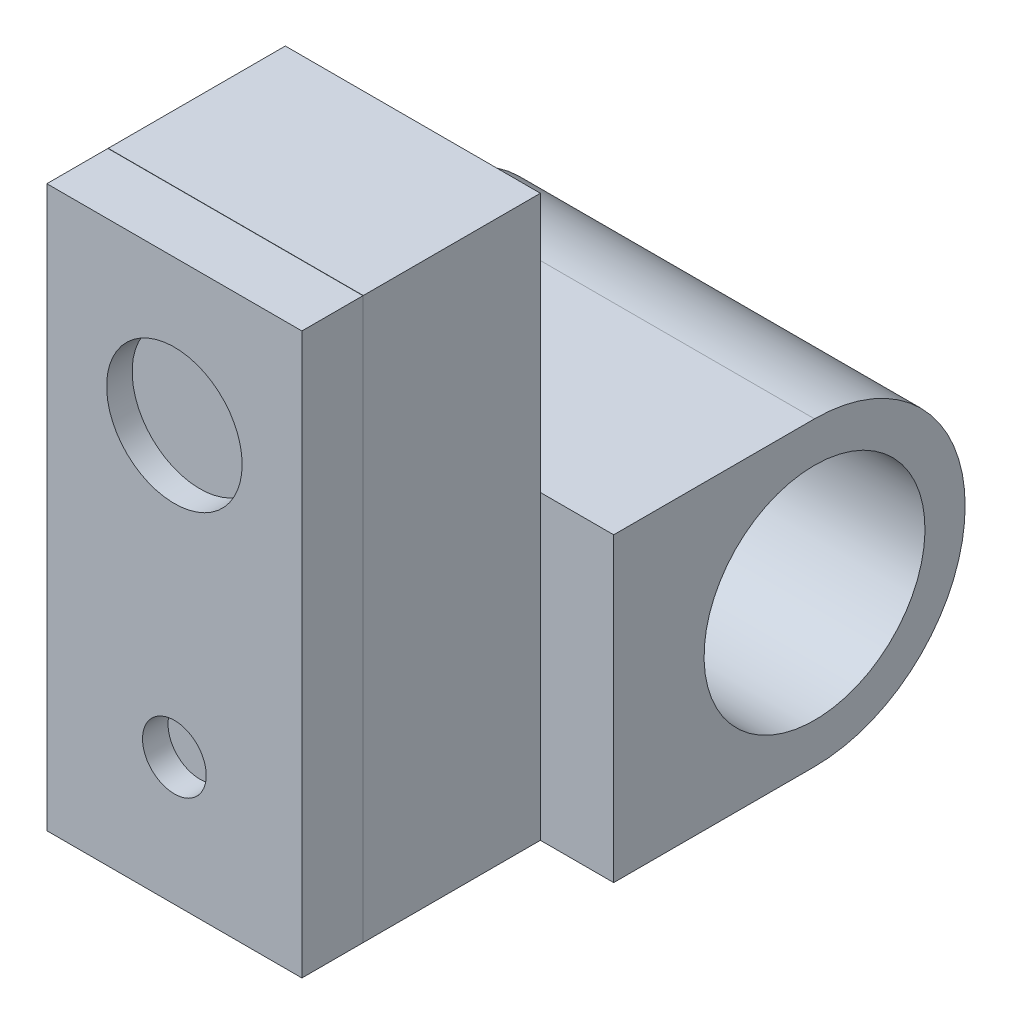
ISO-10303-21;
HEADER;
FILE_DESCRIPTION(('STEP AP214'),'2;1');
FILE_NAME('part.step','',(''),(''),'','','');
FILE_SCHEMA(('AUTOMOTIVE_DESIGN { 1 0 10303 214 1 1 1 1 }'));
ENDSEC;
DATA;
#1=APPLICATION_CONTEXT('core data for automotive mechanical design processes');
#2=APPLICATION_PROTOCOL_DEFINITION('international standard','automotive_design',2000,#1);
#3=PRODUCT_CONTEXT('',#1,'mechanical');
#4=PRODUCT('Part','Part','',(#3));
#5=PRODUCT_RELATED_PRODUCT_CATEGORY('part','',(#4));
#6=PRODUCT_DEFINITION_FORMATION('','',#4);
#7=PRODUCT_DEFINITION_CONTEXT('part definition',#1,'design');
#8=PRODUCT_DEFINITION('design','',#6,#7);
#9=PRODUCT_DEFINITION_SHAPE('','',#8);
#10=(LENGTH_UNIT() NAMED_UNIT(*) SI_UNIT(.MILLI.,.METRE.));
#11=(NAMED_UNIT(*) PLANE_ANGLE_UNIT() SI_UNIT($,.RADIAN.));
#12=(NAMED_UNIT(*) SI_UNIT($,.STERADIAN.) SOLID_ANGLE_UNIT());
#13=UNCERTAINTY_MEASURE_WITH_UNIT(LENGTH_MEASURE(1.E-05),#10,'distance_accuracy_value','');
#14=(GEOMETRIC_REPRESENTATION_CONTEXT(3) GLOBAL_UNCERTAINTY_ASSIGNED_CONTEXT((#13)) GLOBAL_UNIT_ASSIGNED_CONTEXT((#10,
#11,#12)) REPRESENTATION_CONTEXT('',''));
#15=CARTESIAN_POINT('',(0.,0.,0.));
#16=DIRECTION('',(0.,0.,1.));
#17=DIRECTION('',(1.,0.,0.));
#18=AXIS2_PLACEMENT_3D('',#15,#16,#17);
#19=CARTESIAN_POINT('',(-12.7,-27.9019,11.8745));
#20=DIRECTION('',(0.,1.,0.));
#21=DIRECTION('',(0.,0.,1.));
#22=AXIS2_PLACEMENT_3D('',#19,#20,#21);
#23=PLANE('',#22);
#24=DIRECTION('',(1.,0.,0.));
#25=VECTOR('',#24,1.);
#26=CARTESIAN_POINT('',(-32.,-27.9019,-31.8745));
#27=LINE('',#26,#25);
#28=CARTESIAN_POINT('',(-20.,-27.9019,-31.8745));
#29=VERTEX_POINT('',#28);
#30=CARTESIAN_POINT('',(20.,-27.9019,-31.8745));
#31=VERTEX_POINT('',#30);
#32=EDGE_CURVE('E166',#29,#31,#27,.T.);
#33=ORIENTED_EDGE('',*,*,#32,.T.);
#34=DIRECTION('',(0.,0.,1.));
#35=VECTOR('',#34,1.);
#36=CARTESIAN_POINT('',(20.,-27.9019,-51.8745));
#37=LINE('',#36,#35);
#38=CARTESIAN_POINT('',(20.,-27.9019,-11.8745));
#39=VERTEX_POINT('',#38);
#40=EDGE_CURVE('E176',#31,#39,#37,.T.);
#41=ORIENTED_EDGE('',*,*,#40,.T.);
#42=DIRECTION('',(-1.,0.,0.));
#43=VECTOR('',#42,1.);
#44=CARTESIAN_POINT('',(20.,-27.9019,-11.8745));
#45=LINE('',#44,#43);
#46=CARTESIAN_POINT('',(12.7,-27.9019,-11.8745));
#47=VERTEX_POINT('',#46);
#48=EDGE_CURVE('E356',#39,#47,#45,.T.);
#49=ORIENTED_EDGE('',*,*,#48,.T.);
#50=DIRECTION('',(0.,0.,-1.));
#51=VECTOR('',#50,1.);
#52=CARTESIAN_POINT('',(12.7,-27.9019,11.8745));
#53=LINE('',#52,#51);
#54=CARTESIAN_POINT('',(12.7,-27.9019,5.7658));
#55=VERTEX_POINT('',#54);
#56=EDGE_CURVE('E309',#55,#47,#53,.T.);
#57=ORIENTED_EDGE('',*,*,#56,.F.);
#58=DIRECTION('',(1.,0.,0.));
#59=VECTOR('',#58,1.);
#60=CARTESIAN_POINT('',(-12.7,-27.9019,5.7658));
#61=LINE('',#60,#59);
#62=CARTESIAN_POINT('',(-12.7,-27.9019,5.7658));
#63=VERTEX_POINT('',#62);
#64=EDGE_CURVE('E252',#63,#55,#61,.T.);
#65=ORIENTED_EDGE('',*,*,#64,.F.);
#66=DIRECTION('',(0.,0.,-1.));
#67=VECTOR('',#66,1.);
#68=CARTESIAN_POINT('',(-12.7,-27.9019,11.8745));
#69=LINE('',#68,#67);
#70=CARTESIAN_POINT('',(-12.7,-27.9019,-11.8745));
#71=VERTEX_POINT('',#70);
#72=EDGE_CURVE('E314',#63,#71,#69,.T.);
#73=ORIENTED_EDGE('',*,*,#72,.T.);
#74=CARTESIAN_POINT('',(-20.,-27.9019,-11.8745));
#75=VERTEX_POINT('',#74);
#76=EDGE_CURVE('E348',#71,#75,#45,.T.);
#77=ORIENTED_EDGE('',*,*,#76,.T.);
#78=DIRECTION('',(0.,0.,1.));
#79=VECTOR('',#78,1.);
#80=CARTESIAN_POINT('',(-20.,-27.9019,-51.8745));
#81=LINE('',#80,#79);
#82=EDGE_CURVE('E179',#29,#75,#81,.T.);
#83=ORIENTED_EDGE('',*,*,#82,.F.);
#84=EDGE_LOOP('',(#33,#41,#49,#57,#65,#73,#77,#83));
#85=FACE_BOUND('',#84,.T.);
#86=ADVANCED_FACE('F41',(#85),#23,.F.);
#87=CARTESIAN_POINT('',(-12.7,-27.9019,-11.8745));
#88=DIRECTION('',(0.,0.,1.));
#89=DIRECTION('',(1.,0.,0.));
#90=AXIS2_PLACEMENT_3D('',#87,#88,#89);
#91=PLANE('',#90);
#92=DIRECTION('',(1.,0.,0.));
#93=VECTOR('',#92,1.);
#94=CARTESIAN_POINT('',(20.,2.0981,-11.8745));
#95=LINE('',#94,#93);
#96=CARTESIAN_POINT('',(-12.7,2.09810000000001,-11.8745));
#97=VERTEX_POINT('',#96);
#98=CARTESIAN_POINT('',(12.7,2.0981,-11.8745));
#99=VERTEX_POINT('',#98);
#100=EDGE_CURVE('E12',#97,#99,#95,.T.);
#101=ORIENTED_EDGE('',*,*,#100,.F.);
#102=DIRECTION('',(0.,-1.,0.));
#103=VECTOR('',#102,1.);
#104=CARTESIAN_POINT('',(-12.7,27.9019,-11.8745));
#105=LINE('',#104,#103);
#106=CARTESIAN_POINT('',(-12.7,27.9019,-11.8745));
#107=VERTEX_POINT('',#106);
#108=EDGE_CURVE('E275',#107,#97,#105,.T.);
#109=ORIENTED_EDGE('',*,*,#108,.F.);
#110=DIRECTION('',(-1.,0.,0.));
#111=VECTOR('',#110,1.);
#112=CARTESIAN_POINT('',(-12.7,27.9019,-11.8745));
#113=LINE('',#112,#111);
#114=CARTESIAN_POINT('',(12.7,27.9019,-11.8745));
#115=VERTEX_POINT('',#114);
#116=EDGE_CURVE('E282',#115,#107,#113,.T.);
#117=ORIENTED_EDGE('',*,*,#116,.F.);
#118=DIRECTION('',(0.,1.,0.));
#119=VECTOR('',#118,1.);
#120=CARTESIAN_POINT('',(12.7,27.9019,-11.8745));
#121=LINE('',#120,#119);
#122=EDGE_CURVE('E278',#99,#115,#121,.T.);
#123=ORIENTED_EDGE('',*,*,#122,.F.);
#124=EDGE_LOOP('',(#101,#109,#117,#123));
#125=FACE_BOUND('',#124,.T.);
#126=ADVANCED_FACE('F400',(#125),#91,.F.);
#127=CARTESIAN_POINT('',(-12.7,27.9019,11.8745));
#128=DIRECTION('',(1.,0.,0.));
#129=DIRECTION('',(0.,1.,0.));
#130=AXIS2_PLACEMENT_3D('',#127,#128,#129);
#131=PLANE('',#130);
#132=DIRECTION('',(0.,0.,-1.));
#133=VECTOR('',#132,1.);
#134=CARTESIAN_POINT('',(-12.7,27.9019,11.8745));
#135=LINE('',#134,#133);
#136=CARTESIAN_POINT('',(-12.7,27.9019,11.8745));
#137=VERTEX_POINT('',#136);
#138=CARTESIAN_POINT('',(-12.7,27.9019,5.7912));
#139=VERTEX_POINT('',#138);
#140=EDGE_CURVE('E300',#137,#139,#135,.T.);
#141=ORIENTED_EDGE('',*,*,#140,.T.);
#142=DIRECTION('',(0.,-1.,0.));
#143=VECTOR('',#142,1.);
#144=CARTESIAN_POINT('',(-12.7,27.9019,5.7912));
#145=LINE('',#144,#143);
#146=CARTESIAN_POINT('',(-12.7,-27.9019,5.7912));
#147=VERTEX_POINT('',#146);
#148=EDGE_CURVE('E245',#139,#147,#145,.T.);
#149=ORIENTED_EDGE('',*,*,#148,.T.);
#150=CARTESIAN_POINT('',(-12.7,-27.9019,11.8745));
#151=VERTEX_POINT('',#150);
#152=EDGE_CURVE('E315',#151,#147,#69,.T.);
#153=ORIENTED_EDGE('',*,*,#152,.F.);
#154=DIRECTION('',(0.,-1.,0.));
#155=VECTOR('',#154,1.);
#156=CARTESIAN_POINT('',(-12.7,27.9019,11.8745));
#157=LINE('',#156,#155);
#158=EDGE_CURVE('E286',#137,#151,#157,.T.);
#159=ORIENTED_EDGE('',*,*,#158,.F.);
#160=EDGE_LOOP('',(#141,#149,#153,#159));
#161=FACE_BOUND('',#160,.T.);
#162=ADVANCED_FACE('F43',(#161),#131,.F.);
#163=ORIENTED_EDGE('',*,*,#152,.T.);
#164=DIRECTION('',(1.,0.,0.));
#165=VECTOR('',#164,1.);
#166=CARTESIAN_POINT('',(-12.7,-27.9019,5.7912));
#167=LINE('',#166,#165);
#168=CARTESIAN_POINT('',(12.7,-27.9019,5.7912));
#169=VERTEX_POINT('',#168);
#170=EDGE_CURVE('E241',#147,#169,#167,.T.);
#171=ORIENTED_EDGE('',*,*,#170,.T.);
#172=CARTESIAN_POINT('',(12.7,-27.9019,11.8745));
#173=VERTEX_POINT('',#172);
#174=EDGE_CURVE('E310',#173,#169,#53,.T.);
#175=ORIENTED_EDGE('',*,*,#174,.F.);
#176=DIRECTION('',(1.,0.,0.));
#177=VECTOR('',#176,1.);
#178=CARTESIAN_POINT('',(-12.7,-27.9019,11.8745));
#179=LINE('',#178,#177);
#180=EDGE_CURVE('E290',#151,#173,#179,.T.);
#181=ORIENTED_EDGE('',*,*,#180,.F.);
#182=EDGE_LOOP('',(#163,#171,#175,#181));
#183=FACE_BOUND('',#182,.T.);
#184=ADVANCED_FACE('F401',(#183),#23,.F.);
#185=CARTESIAN_POINT('',(12.7,27.9019,11.8745));
#186=DIRECTION('',(-1.,0.,0.));
#187=DIRECTION('',(0.,-1.,0.));
#188=AXIS2_PLACEMENT_3D('',#185,#186,#187);
#189=PLANE('',#188);
#190=ORIENTED_EDGE('',*,*,#174,.T.);
#191=DIRECTION('',(0.,1.,0.));
#192=VECTOR('',#191,1.);
#193=CARTESIAN_POINT('',(12.7,27.9019,5.7912));
#194=LINE('',#193,#192);
#195=CARTESIAN_POINT('',(12.7,27.9019,5.7912));
#196=VERTEX_POINT('',#195);
#197=EDGE_CURVE('E228',#169,#196,#194,.T.);
#198=ORIENTED_EDGE('',*,*,#197,.T.);
#199=DIRECTION('',(0.,0.,-1.));
#200=VECTOR('',#199,1.);
#201=CARTESIAN_POINT('',(12.7,27.9019,11.8745));
#202=LINE('',#201,#200);
#203=CARTESIAN_POINT('',(12.7,27.9019,11.8745));
#204=VERTEX_POINT('',#203);
#205=EDGE_CURVE('E305',#204,#196,#202,.T.);
#206=ORIENTED_EDGE('',*,*,#205,.F.);
#207=DIRECTION('',(0.,1.,0.));
#208=VECTOR('',#207,1.);
#209=CARTESIAN_POINT('',(12.7,27.9019,11.8745));
#210=LINE('',#209,#208);
#211=EDGE_CURVE('E293',#173,#204,#210,.T.);
#212=ORIENTED_EDGE('',*,*,#211,.F.);
#213=EDGE_LOOP('',(#190,#198,#206,#212));
#214=FACE_BOUND('',#213,.T.);
#215=ADVANCED_FACE('F408',(#214),#189,.F.);
#216=CARTESIAN_POINT('',(-12.7,27.9019,11.8745));
#217=DIRECTION('',(0.,-1.,0.));
#218=DIRECTION('',(0.,0.,-1.));
#219=AXIS2_PLACEMENT_3D('',#216,#217,#218);
#220=PLANE('',#219);
#221=ORIENTED_EDGE('',*,*,#205,.T.);
#222=DIRECTION('',(-1.,0.,0.));
#223=VECTOR('',#222,1.);
#224=CARTESIAN_POINT('',(-12.7,27.9019,5.7912));
#225=LINE('',#224,#223);
#226=EDGE_CURVE('E319',#196,#139,#225,.T.);
#227=ORIENTED_EDGE('',*,*,#226,.T.);
#228=ORIENTED_EDGE('',*,*,#140,.F.);
#229=DIRECTION('',(-1.,0.,0.));
#230=VECTOR('',#229,1.);
#231=CARTESIAN_POINT('',(-12.7,27.9019,11.8745));
#232=LINE('',#231,#230);
#233=EDGE_CURVE('E296',#204,#137,#232,.T.);
#234=ORIENTED_EDGE('',*,*,#233,.F.);
#235=EDGE_LOOP('',(#221,#227,#228,#234));
#236=FACE_BOUND('',#235,.T.);
#237=ADVANCED_FACE('F414',(#236),#220,.F.);
#238=CARTESIAN_POINT('',(-12.7,-27.9019,11.8745));
#239=DIRECTION('',(0.,0.,1.));
#240=DIRECTION('',(1.,0.,0.));
#241=AXIS2_PLACEMENT_3D('',#238,#239,#240);
#242=PLANE('',#241);
#243=CARTESIAN_POINT('',(0.,-15.2019,11.8745));
#244=DIRECTION('',(0.,0.,1.));
#245=DIRECTION('',(1.,0.,0.));
#246=AXIS2_PLACEMENT_3D('',#243,#244,#245);
#247=CIRCLE('',#246,3.175);
#248=CARTESIAN_POINT('',(3.175,-15.2019,11.8745));
#249=VERTEX_POINT('',#248);
#250=EDGE_CURVE('E258',#249,#249,#247,.T.);
#251=ORIENTED_EDGE('',*,*,#250,.F.);
#252=EDGE_LOOP('',(#251));
#253=FACE_BOUND('',#252,.T.);
#254=CARTESIAN_POINT('',(0.,13.4112,11.8745));
#255=DIRECTION('',(0.,0.,1.));
#256=DIRECTION('',(1.,0.,0.));
#257=AXIS2_PLACEMENT_3D('',#254,#255,#256);
#258=CIRCLE('',#257,6.746875);
#259=CARTESIAN_POINT('',(6.746875,13.4112,11.8745));
#260=VERTEX_POINT('',#259);
#261=EDGE_CURVE('E266',#260,#260,#258,.T.);
#262=ORIENTED_EDGE('',*,*,#261,.F.);
#263=EDGE_LOOP('',(#262));
#264=FACE_BOUND('',#263,.T.);
#265=ORIENTED_EDGE('',*,*,#158,.T.);
#266=ORIENTED_EDGE('',*,*,#180,.T.);
#267=ORIENTED_EDGE('',*,*,#211,.T.);
#268=ORIENTED_EDGE('',*,*,#233,.T.);
#269=EDGE_LOOP('',(#265,#266,#267,#268));
#270=FACE_BOUND('',#269,.T.);
#271=ADVANCED_FACE('F429',(#253,#264,#270),#242,.T.);
#272=CARTESIAN_POINT('',(0.,13.4112,9.3345));
#273=DIRECTION('',(0.,0.,1.));
#274=DIRECTION('',(1.,0.,0.));
#275=AXIS2_PLACEMENT_3D('',#272,#273,#274);
#276=CYLINDRICAL_SURFACE('',#275,6.746875);
#277=CARTESIAN_POINT('',(0.,13.4112,9.3345));
#278=DIRECTION('',(0.,0.,1.));
#279=DIRECTION('',(1.,0.,0.));
#280=AXIS2_PLACEMENT_3D('',#277,#278,#279);
#281=CIRCLE('',#280,6.746875);
#282=CARTESIAN_POINT('',(6.746875,13.4112,9.3345));
#283=VERTEX_POINT('',#282);
#284=EDGE_CURVE('E270',#283,#283,#281,.T.);
#285=ORIENTED_EDGE('',*,*,#284,.F.);
#286=EDGE_LOOP('',(#285));
#287=FACE_BOUND('',#286,.T.);
#288=ORIENTED_EDGE('',*,*,#261,.T.);
#289=EDGE_LOOP('',(#288));
#290=FACE_BOUND('',#289,.T.);
#291=ADVANCED_FACE('F431',(#287,#290),#276,.F.);
#292=CARTESIAN_POINT('',(0.,13.4112,9.3345));
#293=DIRECTION('',(0.,0.,1.));
#294=DIRECTION('',(1.,0.,0.));
#295=AXIS2_PLACEMENT_3D('',#292,#293,#294);
#296=PLANE('',#295);
#297=ORIENTED_EDGE('',*,*,#284,.T.);
#298=EDGE_LOOP('',(#297));
#299=FACE_BOUND('',#298,.T.);
#300=ADVANCED_FACE('F438',(#299),#296,.T.);
#301=CARTESIAN_POINT('',(0.,-15.2019,0.354243878930845));
#302=DIRECTION('',(0.,0.,1.));
#303=DIRECTION('',(1.,0.,0.));
#304=AXIS2_PLACEMENT_3D('',#301,#302,#303);
#305=CYLINDRICAL_SURFACE('',#304,3.175);
#306=CARTESIAN_POINT('',(0.,-15.2019,9.3345));
#307=DIRECTION('',(0.,0.,1.));
#308=DIRECTION('',(1.,0.,0.));
#309=AXIS2_PLACEMENT_3D('',#306,#307,#308);
#310=CIRCLE('',#309,3.175);
#311=CARTESIAN_POINT('',(3.175,-15.2019,9.3345));
#312=VERTEX_POINT('',#311);
#313=EDGE_CURVE('E262',#312,#312,#310,.F.);
#314=ORIENTED_EDGE('',*,*,#313,.T.);
#315=EDGE_LOOP('',(#314));
#316=FACE_BOUND('',#315,.T.);
#317=ORIENTED_EDGE('',*,*,#250,.T.);
#318=EDGE_LOOP('',(#317));
#319=FACE_BOUND('',#318,.T.);
#320=ADVANCED_FACE('F447',(#316,#319),#305,.F.);
#321=CARTESIAN_POINT('',(0.,13.4112,9.3345));
#322=DIRECTION('',(0.,0.,1.));
#323=DIRECTION('',(1.,0.,0.));
#324=AXIS2_PLACEMENT_3D('',#321,#322,#323);
#325=PLANE('',#324);
#326=ORIENTED_EDGE('',*,*,#313,.F.);
#327=EDGE_LOOP('',(#326));
#328=FACE_BOUND('',#327,.T.);
#329=ADVANCED_FACE('F451',(#328),#325,.T.);
#330=CARTESIAN_POINT('',(0.,0.,5.7658));
#331=DIRECTION('',(0.,0.,1.));
#332=DIRECTION('',(1.,0.,0.));
#333=AXIS2_PLACEMENT_3D('',#330,#331,#332);
#334=PLANE('',#333);
#335=DIRECTION('',(0.,-1.,0.));
#336=VECTOR('',#335,1.);
#337=CARTESIAN_POINT('',(-12.573,27.7749,5.7658));
#338=LINE('',#337,#336);
#339=CARTESIAN_POINT('',(-12.573,27.7749,5.7658));
#340=VERTEX_POINT('',#339);
#341=CARTESIAN_POINT('',(-12.573,-27.7749,5.7658));
#342=VERTEX_POINT('',#341);
#343=EDGE_CURVE('E220',#340,#342,#338,.T.);
#344=ORIENTED_EDGE('',*,*,#343,.F.);
#345=DIRECTION('',(-1.,0.,0.));
#346=VECTOR('',#345,1.);
#347=CARTESIAN_POINT('',(12.573,27.7749,5.7658));
#348=LINE('',#347,#346);
#349=CARTESIAN_POINT('',(12.573,27.7749,5.7658));
#350=VERTEX_POINT('',#349);
#351=EDGE_CURVE('E216',#350,#340,#348,.T.);
#352=ORIENTED_EDGE('',*,*,#351,.F.);
#353=DIRECTION('',(0.,1.,0.));
#354=VECTOR('',#353,1.);
#355=CARTESIAN_POINT('',(12.573,-27.7749,5.7658));
#356=LINE('',#355,#354);
#357=CARTESIAN_POINT('',(12.573,-27.7749,5.7658));
#358=VERTEX_POINT('',#357);
#359=EDGE_CURVE('E212',#358,#350,#356,.T.);
#360=ORIENTED_EDGE('',*,*,#359,.F.);
#361=DIRECTION('',(1.,0.,0.));
#362=VECTOR('',#361,1.);
#363=CARTESIAN_POINT('',(-12.573,-27.7749,5.7658));
#364=LINE('',#363,#362);
#365=EDGE_CURVE('E208',#342,#358,#364,.T.);
#366=ORIENTED_EDGE('',*,*,#365,.F.);
#367=EDGE_LOOP('',(#344,#352,#360,#366));
#368=FACE_BOUND('',#367,.T.);
#369=DIRECTION('',(0.,-1.,0.));
#370=VECTOR('',#369,1.);
#371=CARTESIAN_POINT('',(-12.7,27.9019,5.7658));
#372=LINE('',#371,#370);
#373=CARTESIAN_POINT('',(-12.7,27.9019,5.7658));
#374=VERTEX_POINT('',#373);
#375=EDGE_CURVE('E255',#374,#63,#372,.T.);
#376=ORIENTED_EDGE('',*,*,#375,.T.);
#377=ORIENTED_EDGE('',*,*,#64,.T.);
#378=DIRECTION('',(0.,1.,0.));
#379=VECTOR('',#378,1.);
#380=CARTESIAN_POINT('',(12.7,27.9019,5.7658));
#381=LINE('',#380,#379);
#382=CARTESIAN_POINT('',(12.7,27.9019,5.7658));
#383=VERTEX_POINT('',#382);
#384=EDGE_CURVE('E249',#55,#383,#381,.T.);
#385=ORIENTED_EDGE('',*,*,#384,.T.);
#386=DIRECTION('',(-1.,0.,0.));
#387=VECTOR('',#386,1.);
#388=CARTESIAN_POINT('',(-12.7,27.9019,5.7658));
#389=LINE('',#388,#387);
#390=EDGE_CURVE('E51',#383,#374,#389,.T.);
#391=ORIENTED_EDGE('',*,*,#390,.T.);
#392=EDGE_LOOP('',(#376,#377,#385,#391));
#393=FACE_BOUND('',#392,.T.);
#394=ADVANCED_FACE('F326',(#368,#393),#334,.T.);
#395=CARTESIAN_POINT('',(0.,0.,5.7912));
#396=DIRECTION('',(0.,0.,1.));
#397=DIRECTION('',(1.,0.,0.));
#398=AXIS2_PLACEMENT_3D('',#395,#396,#397);
#399=PLANE('',#398);
#400=DIRECTION('',(1.,0.,0.));
#401=VECTOR('',#400,1.);
#402=CARTESIAN_POINT('',(-12.573,-27.7749,5.7912));
#403=LINE('',#402,#401);
#404=CARTESIAN_POINT('',(-12.573,-27.7749,5.7912));
#405=VERTEX_POINT('',#404);
#406=CARTESIAN_POINT('',(12.573,-27.7749,5.7912));
#407=VERTEX_POINT('',#406);
#408=EDGE_CURVE('E187',#405,#407,#403,.T.);
#409=ORIENTED_EDGE('',*,*,#408,.T.);
#410=DIRECTION('',(0.,1.,0.));
#411=VECTOR('',#410,1.);
#412=CARTESIAN_POINT('',(12.573,-27.7749,5.7912));
#413=LINE('',#412,#411);
#414=CARTESIAN_POINT('',(12.573,27.7749,5.7912));
#415=VERTEX_POINT('',#414);
#416=EDGE_CURVE('E191',#407,#415,#413,.T.);
#417=ORIENTED_EDGE('',*,*,#416,.T.);
#418=DIRECTION('',(-1.,0.,0.));
#419=VECTOR('',#418,1.);
#420=CARTESIAN_POINT('',(12.573,27.7749,5.7912));
#421=LINE('',#420,#419);
#422=CARTESIAN_POINT('',(-12.573,27.7749,5.7912));
#423=VERTEX_POINT('',#422);
#424=EDGE_CURVE('E200',#415,#423,#421,.T.);
#425=ORIENTED_EDGE('',*,*,#424,.T.);
#426=DIRECTION('',(0.,-1.,0.));
#427=VECTOR('',#426,1.);
#428=CARTESIAN_POINT('',(-12.573,27.7749,5.7912));
#429=LINE('',#428,#427);
#430=EDGE_CURVE('E204',#423,#405,#429,.T.);
#431=ORIENTED_EDGE('',*,*,#430,.T.);
#432=EDGE_LOOP('',(#409,#417,#425,#431));
#433=FACE_BOUND('',#432,.T.);
#434=ORIENTED_EDGE('',*,*,#226,.F.);
#435=ORIENTED_EDGE('',*,*,#197,.F.);
#436=ORIENTED_EDGE('',*,*,#170,.F.);
#437=ORIENTED_EDGE('',*,*,#148,.F.);
#438=EDGE_LOOP('',(#434,#435,#436,#437));
#439=FACE_BOUND('',#438,.T.);
#440=ADVANCED_FACE('F423',(#433,#439),#399,.F.);
#441=CARTESIAN_POINT('',(-12.573,-27.7749,5.7658));
#442=DIRECTION('',(0.,-1.,0.));
#443=DIRECTION('',(0.,0.,-1.));
#444=AXIS2_PLACEMENT_3D('',#441,#442,#443);
#445=PLANE('',#444);
#446=ORIENTED_EDGE('',*,*,#408,.F.);
#447=DIRECTION('',(0.,0.,1.));
#448=VECTOR('',#447,1.);
#449=CARTESIAN_POINT('',(-12.573,-27.7749,5.7658));
#450=LINE('',#449,#448);
#451=EDGE_CURVE('E225',#342,#405,#450,.T.);
#452=ORIENTED_EDGE('',*,*,#451,.F.);
#453=ORIENTED_EDGE('',*,*,#365,.T.);
#454=DIRECTION('',(0.,0.,1.));
#455=VECTOR('',#454,1.);
#456=CARTESIAN_POINT('',(12.573,-27.7749,5.7658));
#457=LINE('',#456,#455);
#458=EDGE_CURVE('E224',#358,#407,#457,.T.);
#459=ORIENTED_EDGE('',*,*,#458,.T.);
#460=EDGE_LOOP('',(#446,#452,#453,#459));
#461=FACE_BOUND('',#460,.T.);
#462=ADVANCED_FACE('F461',(#461),#445,.T.);
#463=CARTESIAN_POINT('',(-12.573,27.7749,5.7658));
#464=DIRECTION('',(-1.,0.,0.));
#465=DIRECTION('',(0.,-1.,0.));
#466=AXIS2_PLACEMENT_3D('',#463,#464,#465);
#467=PLANE('',#466);
#468=ORIENTED_EDGE('',*,*,#430,.F.);
#469=DIRECTION('',(0.,0.,1.));
#470=VECTOR('',#469,1.);
#471=CARTESIAN_POINT('',(-12.573,27.7749,5.7658));
#472=LINE('',#471,#470);
#473=EDGE_CURVE('E229',#340,#423,#472,.T.);
#474=ORIENTED_EDGE('',*,*,#473,.F.);
#475=ORIENTED_EDGE('',*,*,#343,.T.);
#476=ORIENTED_EDGE('',*,*,#451,.T.);
#477=EDGE_LOOP('',(#468,#474,#475,#476));
#478=FACE_BOUND('',#477,.T.);
#479=ADVANCED_FACE('F465',(#478),#467,.T.);
#480=CARTESIAN_POINT('',(12.573,27.7749,5.7658));
#481=DIRECTION('',(0.,1.,0.));
#482=DIRECTION('',(0.,0.,1.));
#483=AXIS2_PLACEMENT_3D('',#480,#481,#482);
#484=PLANE('',#483);
#485=ORIENTED_EDGE('',*,*,#424,.F.);
#486=DIRECTION('',(0.,0.,1.));
#487=VECTOR('',#486,1.);
#488=CARTESIAN_POINT('',(12.573,27.7749,5.7658));
#489=LINE('',#488,#487);
#490=EDGE_CURVE('E232',#350,#415,#489,.T.);
#491=ORIENTED_EDGE('',*,*,#490,.F.);
#492=ORIENTED_EDGE('',*,*,#351,.T.);
#493=ORIENTED_EDGE('',*,*,#473,.T.);
#494=EDGE_LOOP('',(#485,#491,#492,#493));
#495=FACE_BOUND('',#494,.T.);
#496=ADVANCED_FACE('F470',(#495),#484,.T.);
#497=CARTESIAN_POINT('',(12.573,-27.7749,5.7658));
#498=DIRECTION('',(1.,0.,0.));
#499=DIRECTION('',(0.,1.,0.));
#500=AXIS2_PLACEMENT_3D('',#497,#498,#499);
#501=PLANE('',#500);
#502=ORIENTED_EDGE('',*,*,#416,.F.);
#503=ORIENTED_EDGE('',*,*,#458,.F.);
#504=ORIENTED_EDGE('',*,*,#359,.T.);
#505=ORIENTED_EDGE('',*,*,#490,.T.);
#506=EDGE_LOOP('',(#502,#503,#504,#505));
#507=FACE_BOUND('',#506,.T.);
#508=ADVANCED_FACE('F467',(#507),#501,.T.);
#509=ORIENTED_EDGE('',*,*,#390,.F.);
#510=EDGE_CURVE('E304',#383,#115,#202,.T.);
#511=ORIENTED_EDGE('',*,*,#510,.T.);
#512=ORIENTED_EDGE('',*,*,#116,.T.);
#513=EDGE_CURVE('E299',#374,#107,#135,.T.);
#514=ORIENTED_EDGE('',*,*,#513,.F.);
#515=EDGE_LOOP('',(#509,#511,#512,#514));
#516=FACE_BOUND('',#515,.T.);
#517=ADVANCED_FACE('F337',(#516),#220,.F.);
#518=ORIENTED_EDGE('',*,*,#384,.F.);
#519=ORIENTED_EDGE('',*,*,#56,.T.);
#520=EDGE_CURVE('E279',#47,#99,#121,.T.);
#521=ORIENTED_EDGE('',*,*,#520,.T.);
#522=ORIENTED_EDGE('',*,*,#122,.T.);
#523=ORIENTED_EDGE('',*,*,#510,.F.);
#524=EDGE_LOOP('',(#518,#519,#521,#522,#523));
#525=FACE_BOUND('',#524,.T.);
#526=ADVANCED_FACE('F416',(#525),#189,.F.);
#527=ORIENTED_EDGE('',*,*,#375,.F.);
#528=ORIENTED_EDGE('',*,*,#513,.T.);
#529=ORIENTED_EDGE('',*,*,#108,.T.);
#530=EDGE_CURVE('E274',#97,#71,#105,.T.);
#531=ORIENTED_EDGE('',*,*,#530,.T.);
#532=ORIENTED_EDGE('',*,*,#72,.F.);
#533=EDGE_LOOP('',(#527,#528,#529,#531,#532));
#534=FACE_BOUND('',#533,.T.);
#535=ADVANCED_FACE('F335',(#534),#131,.F.);
#536=CARTESIAN_POINT('',(0.,0.,-11.8745));
#537=DIRECTION('',(0.,0.,-1.));
#538=DIRECTION('',(-1.,0.,0.));
#539=AXIS2_PLACEMENT_3D('',#536,#537,#538);
#540=PLANE('',#539);
#541=ORIENTED_EDGE('',*,*,#530,.F.);
#542=CARTESIAN_POINT('',(-20.,2.0981,-11.8745));
#543=VERTEX_POINT('',#542);
#544=EDGE_CURVE('E53',#543,#97,#95,.T.);
#545=ORIENTED_EDGE('',*,*,#544,.F.);
#546=DIRECTION('',(0.,1.,0.));
#547=VECTOR('',#546,1.);
#548=CARTESIAN_POINT('',(-20.,2.0981,-11.8745));
#549=LINE('',#548,#547);
#550=EDGE_CURVE('E354',#75,#543,#549,.T.);
#551=ORIENTED_EDGE('',*,*,#550,.F.);
#552=ORIENTED_EDGE('',*,*,#76,.F.);
#553=EDGE_LOOP('',(#541,#545,#551,#552));
#554=FACE_BOUND('',#553,.T.);
#555=ADVANCED_FACE('F352',(#554),#540,.F.);
#556=CARTESIAN_POINT('',(20.,2.0981,-51.8745));
#557=DIRECTION('',(-1.,0.,0.));
#558=DIRECTION('',(0.,-1.,0.));
#559=AXIS2_PLACEMENT_3D('',#556,#557,#558);
#560=PLANE('',#559);
#561=CARTESIAN_POINT('',(20.,-12.9019,-31.8745));
#562=DIRECTION('',(1.,0.,0.));
#563=DIRECTION('',(0.,1.,0.));
#564=AXIS2_PLACEMENT_3D('',#561,#562,#563);
#565=CIRCLE('',#564,11.);
#566=CARTESIAN_POINT('',(20.,-1.90190000000001,-31.8745));
#567=VERTEX_POINT('',#566);
#568=EDGE_CURVE('E375',#567,#567,#565,.T.);
#569=ORIENTED_EDGE('',*,*,#568,.F.);
#570=EDGE_LOOP('',(#569));
#571=FACE_BOUND('',#570,.T.);
#572=ORIENTED_EDGE('',*,*,#40,.F.);
#573=CARTESIAN_POINT('',(20.,-12.9019,-31.8745));
#574=DIRECTION('',(-1.,0.,0.));
#575=DIRECTION('',(0.,1.,0.));
#576=AXIS2_PLACEMENT_3D('',#573,#574,#575);
#577=CIRCLE('',#576,15.);
#578=CARTESIAN_POINT('',(20.,2.0981,-31.8745));
#579=VERTEX_POINT('',#578);
#580=EDGE_CURVE('E163',#579,#31,#577,.T.);
#581=ORIENTED_EDGE('',*,*,#580,.F.);
#582=DIRECTION('',(0.,0.,1.));
#583=VECTOR('',#582,1.);
#584=CARTESIAN_POINT('',(20.,2.0981,-51.8745));
#585=LINE('',#584,#583);
#586=CARTESIAN_POINT('',(20.,2.0981,-11.8745));
#587=VERTEX_POINT('',#586);
#588=EDGE_CURVE('E366',#579,#587,#585,.T.);
#589=ORIENTED_EDGE('',*,*,#588,.T.);
#590=DIRECTION('',(0.,-1.,0.));
#591=VECTOR('',#590,1.);
#592=CARTESIAN_POINT('',(20.,2.0981,-11.8745));
#593=LINE('',#592,#591);
#594=EDGE_CURVE('E185',#587,#39,#593,.T.);
#595=ORIENTED_EDGE('',*,*,#594,.T.);
#596=EDGE_LOOP('',(#572,#581,#589,#595));
#597=FACE_BOUND('',#596,.T.);
#598=ADVANCED_FACE('F183',(#571,#597),#560,.F.);
#599=CARTESIAN_POINT('',(-20.,2.0981,-51.8745));
#600=DIRECTION('',(1.,0.,0.));
#601=DIRECTION('',(0.,1.,0.));
#602=AXIS2_PLACEMENT_3D('',#599,#600,#601);
#603=PLANE('',#602);
#604=CARTESIAN_POINT('',(-20.,-12.9019,-31.8745));
#605=DIRECTION('',(1.,0.,0.));
#606=DIRECTION('',(0.,1.,0.));
#607=AXIS2_PLACEMENT_3D('',#604,#605,#606);
#608=CIRCLE('',#607,11.);
#609=CARTESIAN_POINT('',(-20.,-1.9019,-31.8745));
#610=VERTEX_POINT('',#609);
#611=EDGE_CURVE('E45',#610,#610,#608,.T.);
#612=ORIENTED_EDGE('',*,*,#611,.T.);
#613=EDGE_LOOP('',(#612));
#614=FACE_BOUND('',#613,.T.);
#615=DIRECTION('',(0.,0.,1.));
#616=VECTOR('',#615,1.);
#617=CARTESIAN_POINT('',(-20.,2.0981,-51.8745));
#618=LINE('',#617,#616);
#619=CARTESIAN_POINT('',(-20.,2.0981,-31.8745));
#620=VERTEX_POINT('',#619);
#621=EDGE_CURVE('E193',#620,#543,#618,.T.);
#622=ORIENTED_EDGE('',*,*,#621,.F.);
#623=CARTESIAN_POINT('',(-20.,-12.9019,-31.8745));
#624=DIRECTION('',(1.,0.,0.));
#625=DIRECTION('',(0.,1.,0.));
#626=AXIS2_PLACEMENT_3D('',#623,#624,#625);
#627=CIRCLE('',#626,15.);
#628=EDGE_CURVE('E61',#620,#29,#627,.F.);
#629=ORIENTED_EDGE('',*,*,#628,.T.);
#630=ORIENTED_EDGE('',*,*,#82,.T.);
#631=ORIENTED_EDGE('',*,*,#550,.T.);
#632=EDGE_LOOP('',(#622,#629,#630,#631));
#633=FACE_BOUND('',#632,.T.);
#634=ADVANCED_FACE('F373',(#614,#633),#603,.F.);
#635=CARTESIAN_POINT('',(20.,2.0981,-51.8745));
#636=DIRECTION('',(0.,-1.,0.));
#637=DIRECTION('',(0.,0.,-1.));
#638=AXIS2_PLACEMENT_3D('',#635,#636,#637);
#639=PLANE('',#638);
#640=ORIENTED_EDGE('',*,*,#588,.F.);
#641=DIRECTION('',(1.,0.,0.));
#642=VECTOR('',#641,1.);
#643=CARTESIAN_POINT('',(-32.,2.09810000000001,-31.8745));
#644=LINE('',#643,#642);
#645=EDGE_CURVE('E167',#620,#579,#644,.T.);
#646=ORIENTED_EDGE('',*,*,#645,.F.);
#647=ORIENTED_EDGE('',*,*,#621,.T.);
#648=ORIENTED_EDGE('',*,*,#544,.T.);
#649=ORIENTED_EDGE('',*,*,#100,.T.);
#650=EDGE_CURVE('E54',#99,#587,#95,.T.);
#651=ORIENTED_EDGE('',*,*,#650,.T.);
#652=EDGE_LOOP('',(#640,#646,#647,#648,#649,#651));
#653=FACE_BOUND('',#652,.T.);
#654=ADVANCED_FACE('F371',(#653),#639,.F.);
#655=ORIENTED_EDGE('',*,*,#520,.F.);
#656=ORIENTED_EDGE('',*,*,#48,.F.);
#657=ORIENTED_EDGE('',*,*,#594,.F.);
#658=ORIENTED_EDGE('',*,*,#650,.F.);
#659=EDGE_LOOP('',(#655,#656,#657,#658));
#660=FACE_BOUND('',#659,.T.);
#661=ADVANCED_FACE('F390',(#660),#540,.F.);
#662=CARTESIAN_POINT('',(-32.,-12.9019,-31.8745));
#663=DIRECTION('',(1.,0.,0.));
#664=DIRECTION('',(0.,1.,0.));
#665=AXIS2_PLACEMENT_3D('',#662,#663,#664);
#666=CYLINDRICAL_SURFACE('',#665,11.);
#667=ORIENTED_EDGE('',*,*,#568,.T.);
#668=EDGE_LOOP('',(#667));
#669=FACE_BOUND('',#668,.T.);
#670=ORIENTED_EDGE('',*,*,#611,.F.);
#671=EDGE_LOOP('',(#670));
#672=FACE_BOUND('',#671,.T.);
#673=ADVANCED_FACE('F388',(#669,#672),#666,.F.);
#674=CARTESIAN_POINT('',(-32.,-12.9019,-31.8745));
#675=DIRECTION('',(1.,0.,0.));
#676=DIRECTION('',(0.,1.,0.));
#677=AXIS2_PLACEMENT_3D('',#674,#675,#676);
#678=CYLINDRICAL_SURFACE('',#677,15.);
#679=ORIENTED_EDGE('',*,*,#645,.T.);
#680=ORIENTED_EDGE('',*,*,#580,.T.);
#681=ORIENTED_EDGE('',*,*,#32,.F.);
#682=ORIENTED_EDGE('',*,*,#628,.F.);
#683=EDGE_LOOP('',(#679,#680,#681,#682));
#684=FACE_BOUND('',#683,.T.);
#685=ADVANCED_FACE('F165',(#684),#678,.T.);
#686=CLOSED_SHELL('',(#86,#126,#162,#184,#215,#237,#271,#291,#300,#320,#329,#394,#440,#462,#479,
#496,#508,#517,#526,#535,#555,#598,#634,#654,#661,#673,#685));
#687=MANIFOLD_SOLID_BREP('B2',#686);
#688=ADVANCED_BREP_SHAPE_REPRESENTATION('',(#18,#687),#14);
#689=SHAPE_DEFINITION_REPRESENTATION(#9,#688);
ENDSEC;
END-ISO-10303-21;
